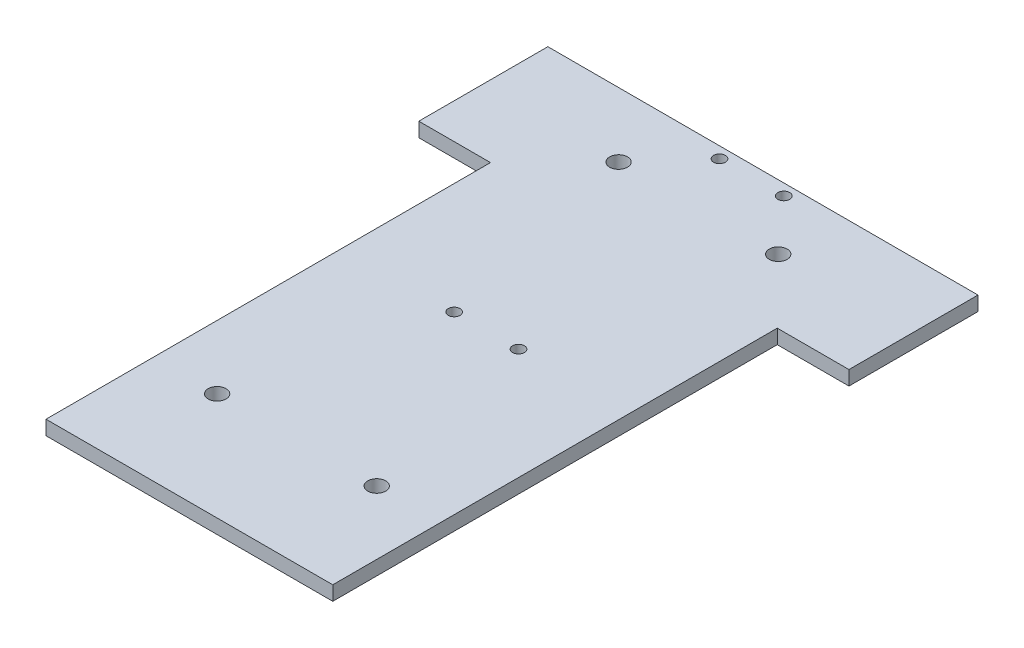
ISO-10303-21;
HEADER;
FILE_DESCRIPTION(('STEP AP214'),'2;1');
FILE_NAME('part.step','',(''),(''),'','','');
FILE_SCHEMA(('AUTOMOTIVE_DESIGN { 1 0 10303 214 1 1 1 1 }'));
ENDSEC;
DATA;
#1=APPLICATION_CONTEXT('core data for automotive mechanical design processes');
#2=APPLICATION_PROTOCOL_DEFINITION('international standard','automotive_design',2000,#1);
#3=PRODUCT_CONTEXT('',#1,'mechanical');
#4=PRODUCT('Part','Part','',(#3));
#5=PRODUCT_RELATED_PRODUCT_CATEGORY('part','',(#4));
#6=PRODUCT_DEFINITION_FORMATION('','',#4);
#7=PRODUCT_DEFINITION_CONTEXT('part definition',#1,'design');
#8=PRODUCT_DEFINITION('design','',#6,#7);
#9=PRODUCT_DEFINITION_SHAPE('','',#8);
#10=(LENGTH_UNIT() NAMED_UNIT(*) SI_UNIT(.MILLI.,.METRE.));
#11=(NAMED_UNIT(*) PLANE_ANGLE_UNIT() SI_UNIT($,.RADIAN.));
#12=(NAMED_UNIT(*) SI_UNIT($,.STERADIAN.) SOLID_ANGLE_UNIT());
#13=UNCERTAINTY_MEASURE_WITH_UNIT(LENGTH_MEASURE(1.E-05),#10,'distance_accuracy_value','');
#14=(GEOMETRIC_REPRESENTATION_CONTEXT(3) GLOBAL_UNCERTAINTY_ASSIGNED_CONTEXT((#13)) GLOBAL_UNIT_ASSIGNED_CONTEXT((#10,
#11,#12)) REPRESENTATION_CONTEXT('',''));
#15=CARTESIAN_POINT('',(0.,0.,0.));
#16=DIRECTION('',(0.,0.,1.));
#17=DIRECTION('',(1.,0.,0.));
#18=AXIS2_PLACEMENT_3D('',#15,#16,#17);
#19=CARTESIAN_POINT('',(0.,2.54,-101.6));
#20=DIRECTION('',(1.,0.,0.));
#21=DIRECTION('',(0.,0.,-1.));
#22=AXIS2_PLACEMENT_3D('',#19,#20,#21);
#23=PLANE('',#22);
#24=DIRECTION('',(0.,0.,1.));
#25=VECTOR('',#24,1.);
#26=CARTESIAN_POINT('',(0.,0.,-101.6));
#27=LINE('',#26,#25);
#28=CARTESIAN_POINT('',(0.,0.,-101.6));
#29=VERTEX_POINT('',#28);
#30=CARTESIAN_POINT('',(0.,0.,-78.74));
#31=VERTEX_POINT('',#30);
#32=EDGE_CURVE('E140',#29,#31,#27,.T.);
#33=ORIENTED_EDGE('',*,*,#32,.T.);
#34=DIRECTION('',(0.,-1.,0.));
#35=VECTOR('',#34,1.);
#36=CARTESIAN_POINT('',(0.,2.54,-78.74));
#37=LINE('',#36,#35);
#38=CARTESIAN_POINT('',(0.,2.54,-78.74));
#39=VERTEX_POINT('',#38);
#40=EDGE_CURVE('E11',#39,#31,#37,.T.);
#41=ORIENTED_EDGE('',*,*,#40,.F.);
#42=DIRECTION('',(0.,0.,1.));
#43=VECTOR('',#42,1.);
#44=CARTESIAN_POINT('',(0.,2.54,-101.6));
#45=LINE('',#44,#43);
#46=CARTESIAN_POINT('',(0.,2.54,-101.6));
#47=VERTEX_POINT('',#46);
#48=EDGE_CURVE('E163',#47,#39,#45,.T.);
#49=ORIENTED_EDGE('',*,*,#48,.F.);
#50=DIRECTION('',(0.,-1.,0.));
#51=VECTOR('',#50,1.);
#52=CARTESIAN_POINT('',(0.,2.54,-101.6));
#53=LINE('',#52,#51);
#54=EDGE_CURVE('E136',#47,#29,#53,.T.);
#55=ORIENTED_EDGE('',*,*,#54,.T.);
#56=EDGE_LOOP('',(#33,#41,#49,#55));
#57=FACE_BOUND('',#56,.T.);
#58=ADVANCED_FACE('F39',(#57),#23,.F.);
#59=CARTESIAN_POINT('',(0.,2.54,-78.74));
#60=DIRECTION('',(0.,0.,-1.));
#61=DIRECTION('',(-1.,0.,0.));
#62=AXIS2_PLACEMENT_3D('',#59,#60,#61);
#63=PLANE('',#62);
#64=DIRECTION('',(1.,0.,0.));
#65=VECTOR('',#64,1.);
#66=CARTESIAN_POINT('',(0.,0.,-78.74));
#67=LINE('',#66,#65);
#68=CARTESIAN_POINT('',(12.7,0.,-78.74));
#69=VERTEX_POINT('',#68);
#70=EDGE_CURVE('E144',#31,#69,#67,.T.);
#71=ORIENTED_EDGE('',*,*,#70,.T.);
#72=DIRECTION('',(0.,-1.,0.));
#73=VECTOR('',#72,1.);
#74=CARTESIAN_POINT('',(12.7,2.54,-78.74));
#75=LINE('',#74,#73);
#76=CARTESIAN_POINT('',(12.7,2.54,-78.74));
#77=VERTEX_POINT('',#76);
#78=EDGE_CURVE('E48',#77,#69,#75,.T.);
#79=ORIENTED_EDGE('',*,*,#78,.F.);
#80=DIRECTION('',(1.,0.,0.));
#81=VECTOR('',#80,1.);
#82=CARTESIAN_POINT('',(0.,2.54,-78.74));
#83=LINE('',#82,#81);
#84=EDGE_CURVE('E99',#39,#77,#83,.T.);
#85=ORIENTED_EDGE('',*,*,#84,.F.);
#86=ORIENTED_EDGE('',*,*,#40,.T.);
#87=EDGE_LOOP('',(#71,#79,#85,#86));
#88=FACE_BOUND('',#87,.T.);
#89=ADVANCED_FACE('F301',(#88),#63,.F.);
#90=CARTESIAN_POINT('',(12.7,2.54,0.));
#91=DIRECTION('',(1.,0.,0.));
#92=DIRECTION('',(0.,0.,-1.));
#93=AXIS2_PLACEMENT_3D('',#90,#91,#92);
#94=PLANE('',#93);
#95=DIRECTION('',(0.,0.,1.));
#96=VECTOR('',#95,1.);
#97=CARTESIAN_POINT('',(12.7,0.,0.));
#98=LINE('',#97,#96);
#99=CARTESIAN_POINT('',(12.7,0.,0.));
#100=VERTEX_POINT('',#99);
#101=EDGE_CURVE('E148',#69,#100,#98,.T.);
#102=ORIENTED_EDGE('',*,*,#101,.T.);
#103=DIRECTION('',(0.,-1.,0.));
#104=VECTOR('',#103,1.);
#105=CARTESIAN_POINT('',(12.7,2.54,0.));
#106=LINE('',#105,#104);
#107=CARTESIAN_POINT('',(12.7,2.54,0.));
#108=VERTEX_POINT('',#107);
#109=EDGE_CURVE('E174',#108,#100,#106,.T.);
#110=ORIENTED_EDGE('',*,*,#109,.F.);
#111=DIRECTION('',(0.,0.,1.));
#112=VECTOR('',#111,1.);
#113=CARTESIAN_POINT('',(12.7,2.54,0.));
#114=LINE('',#113,#112);
#115=EDGE_CURVE('E184',#77,#108,#114,.T.);
#116=ORIENTED_EDGE('',*,*,#115,.F.);
#117=ORIENTED_EDGE('',*,*,#78,.T.);
#118=EDGE_LOOP('',(#102,#110,#116,#117));
#119=FACE_BOUND('',#118,.T.);
#120=ADVANCED_FACE('F182',(#119),#94,.F.);
#121=CARTESIAN_POINT('',(12.7,2.54,0.));
#122=DIRECTION('',(0.,0.,-1.));
#123=DIRECTION('',(-1.,0.,0.));
#124=AXIS2_PLACEMENT_3D('',#121,#122,#123);
#125=PLANE('',#124);
#126=DIRECTION('',(1.,0.,0.));
#127=VECTOR('',#126,1.);
#128=CARTESIAN_POINT('',(12.7,0.,0.));
#129=LINE('',#128,#127);
#130=CARTESIAN_POINT('',(63.5,0.,0.));
#131=VERTEX_POINT('',#130);
#132=EDGE_CURVE('E151',#100,#131,#129,.T.);
#133=ORIENTED_EDGE('',*,*,#132,.T.);
#134=DIRECTION('',(0.,-1.,0.));
#135=VECTOR('',#134,1.);
#136=CARTESIAN_POINT('',(63.5,2.54,0.));
#137=LINE('',#136,#135);
#138=CARTESIAN_POINT('',(63.5,2.54,0.));
#139=VERTEX_POINT('',#138);
#140=EDGE_CURVE('E170',#139,#131,#137,.T.);
#141=ORIENTED_EDGE('',*,*,#140,.F.);
#142=DIRECTION('',(1.,0.,0.));
#143=VECTOR('',#142,1.);
#144=CARTESIAN_POINT('',(12.7,2.54,0.));
#145=LINE('',#144,#143);
#146=EDGE_CURVE('E197',#108,#139,#145,.T.);
#147=ORIENTED_EDGE('',*,*,#146,.F.);
#148=ORIENTED_EDGE('',*,*,#109,.T.);
#149=EDGE_LOOP('',(#133,#141,#147,#148));
#150=FACE_BOUND('',#149,.T.);
#151=ADVANCED_FACE('F192',(#150),#125,.F.);
#152=CARTESIAN_POINT('',(63.5,2.54,0.));
#153=DIRECTION('',(-1.,0.,0.));
#154=DIRECTION('',(0.,0.,1.));
#155=AXIS2_PLACEMENT_3D('',#152,#153,#154);
#156=PLANE('',#155);
#157=DIRECTION('',(0.,0.,-1.));
#158=VECTOR('',#157,1.);
#159=CARTESIAN_POINT('',(63.5,0.,0.));
#160=LINE('',#159,#158);
#161=CARTESIAN_POINT('',(63.5,0.,-78.74));
#162=VERTEX_POINT('',#161);
#163=EDGE_CURVE('E154',#131,#162,#160,.T.);
#164=ORIENTED_EDGE('',*,*,#163,.T.);
#165=DIRECTION('',(0.,-1.,0.));
#166=VECTOR('',#165,1.);
#167=CARTESIAN_POINT('',(63.5,2.54,-78.74));
#168=LINE('',#167,#166);
#169=CARTESIAN_POINT('',(63.5,2.54,-78.74));
#170=VERTEX_POINT('',#169);
#171=EDGE_CURVE('E129',#170,#162,#168,.T.);
#172=ORIENTED_EDGE('',*,*,#171,.F.);
#173=DIRECTION('',(0.,0.,-1.));
#174=VECTOR('',#173,1.);
#175=CARTESIAN_POINT('',(63.5,2.54,0.));
#176=LINE('',#175,#174);
#177=EDGE_CURVE('E118',#139,#170,#176,.T.);
#178=ORIENTED_EDGE('',*,*,#177,.F.);
#179=ORIENTED_EDGE('',*,*,#140,.T.);
#180=EDGE_LOOP('',(#164,#172,#178,#179));
#181=FACE_BOUND('',#180,.T.);
#182=ADVANCED_FACE('F195',(#181),#156,.F.);
#183=CARTESIAN_POINT('',(76.2,2.54,-78.74));
#184=DIRECTION('',(0.,0.,-1.));
#185=DIRECTION('',(-1.,0.,0.));
#186=AXIS2_PLACEMENT_3D('',#183,#184,#185);
#187=PLANE('',#186);
#188=DIRECTION('',(1.,0.,0.));
#189=VECTOR('',#188,1.);
#190=CARTESIAN_POINT('',(76.2,0.,-78.74));
#191=LINE('',#190,#189);
#192=CARTESIAN_POINT('',(76.2,0.,-78.74));
#193=VERTEX_POINT('',#192);
#194=EDGE_CURVE('E127',#162,#193,#191,.T.);
#195=ORIENTED_EDGE('',*,*,#194,.T.);
#196=DIRECTION('',(0.,-1.,0.));
#197=VECTOR('',#196,1.);
#198=CARTESIAN_POINT('',(76.2,2.54,-78.74));
#199=LINE('',#198,#197);
#200=CARTESIAN_POINT('',(76.2,2.54,-78.74));
#201=VERTEX_POINT('',#200);
#202=EDGE_CURVE('E124',#201,#193,#199,.T.);
#203=ORIENTED_EDGE('',*,*,#202,.F.);
#204=DIRECTION('',(1.,0.,0.));
#205=VECTOR('',#204,1.);
#206=CARTESIAN_POINT('',(76.2,2.54,-78.74));
#207=LINE('',#206,#205);
#208=EDGE_CURVE('E112',#170,#201,#207,.T.);
#209=ORIENTED_EDGE('',*,*,#208,.F.);
#210=ORIENTED_EDGE('',*,*,#171,.T.);
#211=EDGE_LOOP('',(#195,#203,#209,#210));
#212=FACE_BOUND('',#211,.T.);
#213=ADVANCED_FACE('F125',(#212),#187,.F.);
#214=CARTESIAN_POINT('',(76.2,2.54,-101.6));
#215=DIRECTION('',(-1.,0.,0.));
#216=DIRECTION('',(0.,0.,1.));
#217=AXIS2_PLACEMENT_3D('',#214,#215,#216);
#218=PLANE('',#217);
#219=DIRECTION('',(0.,0.,-1.));
#220=VECTOR('',#219,1.);
#221=CARTESIAN_POINT('',(76.2,0.,-101.6));
#222=LINE('',#221,#220);
#223=CARTESIAN_POINT('',(76.2,0.,-101.6));
#224=VERTEX_POINT('',#223);
#225=EDGE_CURVE('E85',#193,#224,#222,.T.);
#226=ORIENTED_EDGE('',*,*,#225,.T.);
#227=DIRECTION('',(0.,-1.,0.));
#228=VECTOR('',#227,1.);
#229=CARTESIAN_POINT('',(76.2,2.54,-101.6));
#230=LINE('',#229,#228);
#231=CARTESIAN_POINT('',(76.2,2.54,-101.6));
#232=VERTEX_POINT('',#231);
#233=EDGE_CURVE('E130',#232,#224,#230,.T.);
#234=ORIENTED_EDGE('',*,*,#233,.F.);
#235=DIRECTION('',(0.,0.,-1.));
#236=VECTOR('',#235,1.);
#237=CARTESIAN_POINT('',(76.2,2.54,-101.6));
#238=LINE('',#237,#236);
#239=EDGE_CURVE('E116',#201,#232,#238,.T.);
#240=ORIENTED_EDGE('',*,*,#239,.F.);
#241=ORIENTED_EDGE('',*,*,#202,.T.);
#242=EDGE_LOOP('',(#226,#234,#240,#241));
#243=FACE_BOUND('',#242,.T.);
#244=ADVANCED_FACE('F132',(#243),#218,.F.);
#245=CARTESIAN_POINT('',(0.,2.54,-101.6));
#246=DIRECTION('',(0.,0.,1.));
#247=DIRECTION('',(1.,0.,0.));
#248=AXIS2_PLACEMENT_3D('',#245,#246,#247);
#249=PLANE('',#248);
#250=DIRECTION('',(-1.,0.,0.));
#251=VECTOR('',#250,1.);
#252=CARTESIAN_POINT('',(0.,0.,-101.6));
#253=LINE('',#252,#251);
#254=EDGE_CURVE('E91',#224,#29,#253,.T.);
#255=ORIENTED_EDGE('',*,*,#254,.T.);
#256=ORIENTED_EDGE('',*,*,#54,.F.);
#257=DIRECTION('',(-1.,0.,0.));
#258=VECTOR('',#257,1.);
#259=CARTESIAN_POINT('',(0.,2.54,-101.6));
#260=LINE('',#259,#258);
#261=EDGE_CURVE('E56',#232,#47,#260,.T.);
#262=ORIENTED_EDGE('',*,*,#261,.F.);
#263=ORIENTED_EDGE('',*,*,#233,.T.);
#264=EDGE_LOOP('',(#255,#256,#262,#263));
#265=FACE_BOUND('',#264,.T.);
#266=ADVANCED_FACE('F308',(#265),#249,.F.);
#267=CARTESIAN_POINT('',(0.,2.54,0.));
#268=DIRECTION('',(0.,1.,0.));
#269=DIRECTION('',(0.,0.,1.));
#270=AXIS2_PLACEMENT_3D('',#267,#268,#269);
#271=PLANE('',#270);
#272=CARTESIAN_POINT('',(52.2378507622248,2.54,-19.05));
#273=DIRECTION('',(0.,1.,0.));
#274=DIRECTION('',(0.,0.,1.));
#275=AXIS2_PLACEMENT_3D('',#272,#273,#274);
#276=CIRCLE('',#275,1.5875);
#277=CARTESIAN_POINT('',(52.2378507622248,2.54,-17.4625));
#278=VERTEX_POINT('',#277);
#279=EDGE_CURVE('E256',#278,#278,#276,.F.);
#280=ORIENTED_EDGE('',*,*,#279,.T.);
#281=EDGE_LOOP('',(#280));
#282=FACE_BOUND('',#281,.T.);
#283=CARTESIAN_POINT('',(23.9621492377752,2.54,-90.17));
#284=DIRECTION('',(0.,1.,0.));
#285=DIRECTION('',(0.,0.,1.));
#286=AXIS2_PLACEMENT_3D('',#283,#284,#285);
#287=CIRCLE('',#286,1.58750000000001);
#288=CARTESIAN_POINT('',(23.9621492377752,2.54,-88.5825));
#289=VERTEX_POINT('',#288);
#290=EDGE_CURVE('E247',#289,#289,#287,.F.);
#291=ORIENTED_EDGE('',*,*,#290,.T.);
#292=EDGE_LOOP('',(#291));
#293=FACE_BOUND('',#292,.T.);
#294=CARTESIAN_POINT('',(52.2378507622248,2.54,-90.17));
#295=DIRECTION('',(0.,1.,0.));
#296=DIRECTION('',(0.,0.,1.));
#297=AXIS2_PLACEMENT_3D('',#294,#295,#296);
#298=CIRCLE('',#297,1.58750000000001);
#299=CARTESIAN_POINT('',(52.2378507622248,2.54,-88.5825));
#300=VERTEX_POINT('',#299);
#301=EDGE_CURVE('E263',#300,#300,#298,.F.);
#302=ORIENTED_EDGE('',*,*,#301,.T.);
#303=EDGE_LOOP('',(#302));
#304=FACE_BOUND('',#303,.T.);
#305=CARTESIAN_POINT('',(23.9621492377752,2.54,-19.05));
#306=DIRECTION('',(0.,1.,0.));
#307=DIRECTION('',(0.,0.,1.));
#308=AXIS2_PLACEMENT_3D('',#305,#306,#307);
#309=CIRCLE('',#308,1.5875);
#310=CARTESIAN_POINT('',(23.9621492377752,2.54,-17.4625));
#311=VERTEX_POINT('',#310);
#312=EDGE_CURVE('E239',#311,#311,#309,.F.);
#313=ORIENTED_EDGE('',*,*,#312,.T.);
#314=EDGE_LOOP('',(#313));
#315=FACE_BOUND('',#314,.T.);
#316=CARTESIAN_POINT('',(32.4,2.54,-99.6));
#317=DIRECTION('',(0.,1.,0.));
#318=DIRECTION('',(0.,0.,1.));
#319=AXIS2_PLACEMENT_3D('',#316,#317,#318);
#320=CIRCLE('',#319,1.04999999999999);
#321=CARTESIAN_POINT('',(32.4,2.54,-98.55));
#322=VERTEX_POINT('',#321);
#323=EDGE_CURVE('E219',#322,#322,#320,.T.);
#324=ORIENTED_EDGE('',*,*,#323,.F.);
#325=EDGE_LOOP('',(#324));
#326=FACE_BOUND('',#325,.T.);
#327=CARTESIAN_POINT('',(43.8,2.54,-52.6));
#328=DIRECTION('',(0.,1.,0.));
#329=DIRECTION('',(0.,0.,1.));
#330=AXIS2_PLACEMENT_3D('',#327,#328,#329);
#331=CIRCLE('',#330,1.04999999999999);
#332=CARTESIAN_POINT('',(43.8,2.54,-51.55));
#333=VERTEX_POINT('',#332);
#334=EDGE_CURVE('E220',#333,#333,#331,.T.);
#335=ORIENTED_EDGE('',*,*,#334,.F.);
#336=EDGE_LOOP('',(#335));
#337=FACE_BOUND('',#336,.T.);
#338=CARTESIAN_POINT('',(32.4,2.54,-52.6));
#339=DIRECTION('',(0.,1.,0.));
#340=DIRECTION('',(0.,0.,1.));
#341=AXIS2_PLACEMENT_3D('',#338,#339,#340);
#342=CIRCLE('',#341,1.05);
#343=CARTESIAN_POINT('',(32.4,2.54,-51.55));
#344=VERTEX_POINT('',#343);
#345=EDGE_CURVE('E234',#344,#344,#342,.T.);
#346=ORIENTED_EDGE('',*,*,#345,.F.);
#347=EDGE_LOOP('',(#346));
#348=FACE_BOUND('',#347,.T.);
#349=CARTESIAN_POINT('',(43.8,2.54,-99.6));
#350=DIRECTION('',(0.,1.,0.));
#351=DIRECTION('',(0.,0.,1.));
#352=AXIS2_PLACEMENT_3D('',#349,#350,#351);
#353=CIRCLE('',#352,1.04999999999999);
#354=CARTESIAN_POINT('',(43.8,2.54,-98.55));
#355=VERTEX_POINT('',#354);
#356=EDGE_CURVE('E210',#355,#355,#353,.T.);
#357=ORIENTED_EDGE('',*,*,#356,.F.);
#358=EDGE_LOOP('',(#357));
#359=FACE_BOUND('',#358,.T.);
#360=ORIENTED_EDGE('',*,*,#48,.T.);
#361=ORIENTED_EDGE('',*,*,#84,.T.);
#362=ORIENTED_EDGE('',*,*,#115,.T.);
#363=ORIENTED_EDGE('',*,*,#146,.T.);
#364=ORIENTED_EDGE('',*,*,#177,.T.);
#365=ORIENTED_EDGE('',*,*,#208,.T.);
#366=ORIENTED_EDGE('',*,*,#239,.T.);
#367=ORIENTED_EDGE('',*,*,#261,.T.);
#368=EDGE_LOOP('',(#360,#361,#362,#363,#364,#365,#366,#367));
#369=FACE_BOUND('',#368,.T.);
#370=ADVANCED_FACE('F114',(#282,#293,#304,#315,#326,#337,#348,#359,#369),#271,.T.);
#371=CARTESIAN_POINT('',(0.,0.,0.));
#372=DIRECTION('',(0.,1.,0.));
#373=DIRECTION('',(0.,0.,1.));
#374=AXIS2_PLACEMENT_3D('',#371,#372,#373);
#375=PLANE('',#374);
#376=CARTESIAN_POINT('',(52.2378507622248,0.,-19.05));
#377=DIRECTION('',(0.,-1.,0.));
#378=DIRECTION('',(0.,0.,-1.));
#379=AXIS2_PLACEMENT_3D('',#376,#377,#378);
#380=CIRCLE('',#379,1.5875);
#381=CARTESIAN_POINT('',(52.2378507622248,0.,-20.6375));
#382=VERTEX_POINT('',#381);
#383=EDGE_CURVE('E243',#382,#382,#380,.T.);
#384=ORIENTED_EDGE('',*,*,#383,.F.);
#385=EDGE_LOOP('',(#384));
#386=FACE_BOUND('',#385,.T.);
#387=CARTESIAN_POINT('',(23.9621492377752,0.,-90.17));
#388=DIRECTION('',(0.,-1.,0.));
#389=DIRECTION('',(0.,0.,-1.));
#390=AXIS2_PLACEMENT_3D('',#387,#388,#389);
#391=CIRCLE('',#390,1.58750000000001);
#392=CARTESIAN_POINT('',(23.9621492377752,0.,-91.7575));
#393=VERTEX_POINT('',#392);
#394=EDGE_CURVE('E251',#393,#393,#391,.T.);
#395=ORIENTED_EDGE('',*,*,#394,.F.);
#396=EDGE_LOOP('',(#395));
#397=FACE_BOUND('',#396,.T.);
#398=CARTESIAN_POINT('',(52.2378507622248,0.,-90.17));
#399=DIRECTION('',(0.,-1.,0.));
#400=DIRECTION('',(0.,0.,-1.));
#401=AXIS2_PLACEMENT_3D('',#398,#399,#400);
#402=CIRCLE('',#401,1.58750000000001);
#403=CARTESIAN_POINT('',(52.2378507622248,0.,-91.7575));
#404=VERTEX_POINT('',#403);
#405=EDGE_CURVE('E252',#404,#404,#402,.T.);
#406=ORIENTED_EDGE('',*,*,#405,.F.);
#407=EDGE_LOOP('',(#406));
#408=FACE_BOUND('',#407,.T.);
#409=CARTESIAN_POINT('',(23.9621492377752,0.,-19.05));
#410=DIRECTION('',(0.,-1.,0.));
#411=DIRECTION('',(0.,0.,-1.));
#412=AXIS2_PLACEMENT_3D('',#409,#410,#411);
#413=CIRCLE('',#412,1.5875);
#414=CARTESIAN_POINT('',(23.9621492377752,0.,-20.6375));
#415=VERTEX_POINT('',#414);
#416=EDGE_CURVE('E238',#415,#415,#413,.T.);
#417=ORIENTED_EDGE('',*,*,#416,.F.);
#418=EDGE_LOOP('',(#417));
#419=FACE_BOUND('',#418,.T.);
#420=CARTESIAN_POINT('',(32.4,0.,-99.6));
#421=DIRECTION('',(0.,1.,0.));
#422=DIRECTION('',(0.,0.,1.));
#423=AXIS2_PLACEMENT_3D('',#420,#421,#422);
#424=CIRCLE('',#423,1.04999999999999);
#425=CARTESIAN_POINT('',(32.4,0.,-98.55));
#426=VERTEX_POINT('',#425);
#427=EDGE_CURVE('E214',#426,#426,#424,.F.);
#428=ORIENTED_EDGE('',*,*,#427,.F.);
#429=EDGE_LOOP('',(#428));
#430=FACE_BOUND('',#429,.T.);
#431=CARTESIAN_POINT('',(43.8,0.,-52.6));
#432=DIRECTION('',(0.,1.,0.));
#433=DIRECTION('',(0.,0.,1.));
#434=AXIS2_PLACEMENT_3D('',#431,#432,#433);
#435=CIRCLE('',#434,1.04999999999999);
#436=CARTESIAN_POINT('',(43.8,0.,-51.55));
#437=VERTEX_POINT('',#436);
#438=EDGE_CURVE('E215',#437,#437,#435,.F.);
#439=ORIENTED_EDGE('',*,*,#438,.F.);
#440=EDGE_LOOP('',(#439));
#441=FACE_BOUND('',#440,.T.);
#442=CARTESIAN_POINT('',(32.4,0.,-52.6));
#443=DIRECTION('',(0.,1.,0.));
#444=DIRECTION('',(0.,0.,1.));
#445=AXIS2_PLACEMENT_3D('',#442,#443,#444);
#446=CIRCLE('',#445,1.05);
#447=CARTESIAN_POINT('',(32.4,0.,-51.55));
#448=VERTEX_POINT('',#447);
#449=EDGE_CURVE('E224',#448,#448,#446,.F.);
#450=ORIENTED_EDGE('',*,*,#449,.F.);
#451=EDGE_LOOP('',(#450));
#452=FACE_BOUND('',#451,.T.);
#453=CARTESIAN_POINT('',(43.8,0.,-99.6));
#454=DIRECTION('',(0.,1.,0.));
#455=DIRECTION('',(0.,0.,1.));
#456=AXIS2_PLACEMENT_3D('',#453,#454,#455);
#457=CIRCLE('',#456,1.04999999999999);
#458=CARTESIAN_POINT('',(43.8,0.,-98.55));
#459=VERTEX_POINT('',#458);
#460=EDGE_CURVE('E145',#459,#459,#457,.F.);
#461=ORIENTED_EDGE('',*,*,#460,.F.);
#462=EDGE_LOOP('',(#461));
#463=FACE_BOUND('',#462,.T.);
#464=ORIENTED_EDGE('',*,*,#32,.F.);
#465=ORIENTED_EDGE('',*,*,#254,.F.);
#466=ORIENTED_EDGE('',*,*,#225,.F.);
#467=ORIENTED_EDGE('',*,*,#194,.F.);
#468=ORIENTED_EDGE('',*,*,#163,.F.);
#469=ORIENTED_EDGE('',*,*,#132,.F.);
#470=ORIENTED_EDGE('',*,*,#101,.F.);
#471=ORIENTED_EDGE('',*,*,#70,.F.);
#472=EDGE_LOOP('',(#464,#465,#466,#467,#468,#469,#470,#471));
#473=FACE_BOUND('',#472,.T.);
#474=ADVANCED_FACE('F188',(#386,#397,#408,#419,#430,#441,#452,#463,#473),#375,.F.);
#475=CARTESIAN_POINT('',(43.8,-0.00100000000000013,-99.6));
#476=DIRECTION('',(0.,1.,0.));
#477=DIRECTION('',(0.,0.,1.));
#478=AXIS2_PLACEMENT_3D('',#475,#476,#477);
#479=CYLINDRICAL_SURFACE('',#478,1.04999999999999);
#480=ORIENTED_EDGE('',*,*,#356,.T.);
#481=EDGE_LOOP('',(#480));
#482=FACE_BOUND('',#481,.T.);
#483=ORIENTED_EDGE('',*,*,#460,.T.);
#484=EDGE_LOOP('',(#483));
#485=FACE_BOUND('',#484,.T.);
#486=ADVANCED_FACE('F275',(#482,#485),#479,.F.);
#487=CARTESIAN_POINT('',(32.4,-0.00100000000000013,-52.6));
#488=DIRECTION('',(0.,1.,0.));
#489=DIRECTION('',(0.,0.,1.));
#490=AXIS2_PLACEMENT_3D('',#487,#488,#489);
#491=CYLINDRICAL_SURFACE('',#490,1.05);
#492=ORIENTED_EDGE('',*,*,#345,.T.);
#493=EDGE_LOOP('',(#492));
#494=FACE_BOUND('',#493,.T.);
#495=ORIENTED_EDGE('',*,*,#449,.T.);
#496=EDGE_LOOP('',(#495));
#497=FACE_BOUND('',#496,.T.);
#498=ADVANCED_FACE('F289',(#494,#497),#491,.F.);
#499=CARTESIAN_POINT('',(43.8,-0.00100000000000013,-52.6));
#500=DIRECTION('',(0.,1.,0.));
#501=DIRECTION('',(0.,0.,1.));
#502=AXIS2_PLACEMENT_3D('',#499,#500,#501);
#503=CYLINDRICAL_SURFACE('',#502,1.04999999999999);
#504=ORIENTED_EDGE('',*,*,#334,.T.);
#505=EDGE_LOOP('',(#504));
#506=FACE_BOUND('',#505,.T.);
#507=ORIENTED_EDGE('',*,*,#438,.T.);
#508=EDGE_LOOP('',(#507));
#509=FACE_BOUND('',#508,.T.);
#510=ADVANCED_FACE('F295',(#506,#509),#503,.F.);
#511=CARTESIAN_POINT('',(32.4,-0.00100000000000013,-99.6));
#512=DIRECTION('',(0.,1.,0.));
#513=DIRECTION('',(0.,0.,1.));
#514=AXIS2_PLACEMENT_3D('',#511,#512,#513);
#515=CYLINDRICAL_SURFACE('',#514,1.04999999999999);
#516=ORIENTED_EDGE('',*,*,#323,.T.);
#517=EDGE_LOOP('',(#516));
#518=FACE_BOUND('',#517,.T.);
#519=ORIENTED_EDGE('',*,*,#427,.T.);
#520=EDGE_LOOP('',(#519));
#521=FACE_BOUND('',#520,.T.);
#522=ADVANCED_FACE('F370',(#518,#521),#515,.F.);
#523=CARTESIAN_POINT('',(23.9621492377752,2.541,-19.05));
#524=DIRECTION('',(0.,-1.,0.));
#525=DIRECTION('',(0.,0.,-1.));
#526=AXIS2_PLACEMENT_3D('',#523,#524,#525);
#527=CYLINDRICAL_SURFACE('',#526,1.5875);
#528=ORIENTED_EDGE('',*,*,#312,.F.);
#529=EDGE_LOOP('',(#528));
#530=FACE_BOUND('',#529,.T.);
#531=ORIENTED_EDGE('',*,*,#416,.T.);
#532=EDGE_LOOP('',(#531));
#533=FACE_BOUND('',#532,.T.);
#534=ADVANCED_FACE('F379',(#530,#533),#527,.F.);
#535=CARTESIAN_POINT('',(52.2378507622248,2.541,-90.17));
#536=DIRECTION('',(0.,-1.,0.));
#537=DIRECTION('',(0.,0.,-1.));
#538=AXIS2_PLACEMENT_3D('',#535,#536,#537);
#539=CYLINDRICAL_SURFACE('',#538,1.58750000000001);
#540=ORIENTED_EDGE('',*,*,#301,.F.);
#541=EDGE_LOOP('',(#540));
#542=FACE_BOUND('',#541,.T.);
#543=ORIENTED_EDGE('',*,*,#405,.T.);
#544=EDGE_LOOP('',(#543));
#545=FACE_BOUND('',#544,.T.);
#546=ADVANCED_FACE('F271',(#542,#545),#539,.F.);
#547=CARTESIAN_POINT('',(23.9621492377752,2.541,-90.17));
#548=DIRECTION('',(0.,-1.,0.));
#549=DIRECTION('',(0.,0.,-1.));
#550=AXIS2_PLACEMENT_3D('',#547,#548,#549);
#551=CYLINDRICAL_SURFACE('',#550,1.58750000000001);
#552=ORIENTED_EDGE('',*,*,#290,.F.);
#553=EDGE_LOOP('',(#552));
#554=FACE_BOUND('',#553,.T.);
#555=ORIENTED_EDGE('',*,*,#394,.T.);
#556=EDGE_LOOP('',(#555));
#557=FACE_BOUND('',#556,.T.);
#558=ADVANCED_FACE('F408',(#554,#557),#551,.F.);
#559=CARTESIAN_POINT('',(52.2378507622248,2.541,-19.05));
#560=DIRECTION('',(0.,-1.,0.));
#561=DIRECTION('',(0.,0.,-1.));
#562=AXIS2_PLACEMENT_3D('',#559,#560,#561);
#563=CYLINDRICAL_SURFACE('',#562,1.5875);
#564=ORIENTED_EDGE('',*,*,#279,.F.);
#565=EDGE_LOOP('',(#564));
#566=FACE_BOUND('',#565,.T.);
#567=ORIENTED_EDGE('',*,*,#383,.T.);
#568=EDGE_LOOP('',(#567));
#569=FACE_BOUND('',#568,.T.);
#570=ADVANCED_FACE('F418',(#566,#569),#563,.F.);
#571=CLOSED_SHELL('',(#58,#89,#120,#151,#182,#213,#244,#266,#370,#474,#486,#498,#510,#522,#534,
#546,#558,#570));
#572=MANIFOLD_SOLID_BREP('B2',#571);
#573=ADVANCED_BREP_SHAPE_REPRESENTATION('',(#18,#572),#14);
#574=SHAPE_DEFINITION_REPRESENTATION(#9,#573);
ENDSEC;
END-ISO-10303-21;
